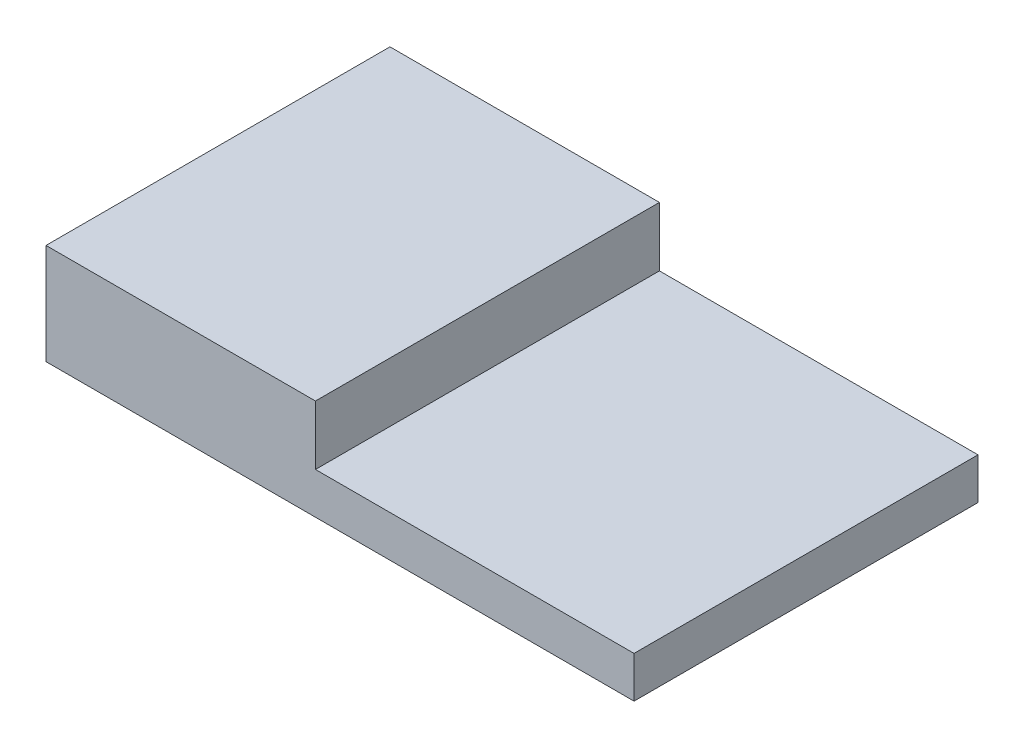
ISO-10303-21;
HEADER;
FILE_DESCRIPTION(('STEP AP214'),'2;1');
FILE_NAME('part.step','',(''),(''),'','','');
FILE_SCHEMA(('AUTOMOTIVE_DESIGN { 1 0 10303 214 1 1 1 1 }'));
ENDSEC;
DATA;
#1=APPLICATION_CONTEXT('core data for automotive mechanical design processes');
#2=APPLICATION_PROTOCOL_DEFINITION('international standard','automotive_design',2000,#1);
#3=PRODUCT_CONTEXT('',#1,'mechanical');
#4=PRODUCT('Part','Part','',(#3));
#5=PRODUCT_RELATED_PRODUCT_CATEGORY('part','',(#4));
#6=PRODUCT_DEFINITION_FORMATION('','',#4);
#7=PRODUCT_DEFINITION_CONTEXT('part definition',#1,'design');
#8=PRODUCT_DEFINITION('design','',#6,#7);
#9=PRODUCT_DEFINITION_SHAPE('','',#8);
#10=(LENGTH_UNIT() NAMED_UNIT(*) SI_UNIT(.MILLI.,.METRE.));
#11=(NAMED_UNIT(*) PLANE_ANGLE_UNIT() SI_UNIT($,.RADIAN.));
#12=(NAMED_UNIT(*) SI_UNIT($,.STERADIAN.) SOLID_ANGLE_UNIT());
#13=UNCERTAINTY_MEASURE_WITH_UNIT(LENGTH_MEASURE(1.E-05),#10,'distance_accuracy_value','');
#14=(GEOMETRIC_REPRESENTATION_CONTEXT(3) GLOBAL_UNCERTAINTY_ASSIGNED_CONTEXT((#13)) GLOBAL_UNIT_ASSIGNED_CONTEXT((#10,
#11,#12)) REPRESENTATION_CONTEXT('',''));
#15=CARTESIAN_POINT('',(0.,0.,0.));
#16=DIRECTION('',(0.,0.,1.));
#17=DIRECTION('',(1.,0.,0.));
#18=AXIS2_PLACEMENT_3D('',#15,#16,#17);
#19=CARTESIAN_POINT('',(49.74579499682,18.5857311320755,-63.5));
#20=DIRECTION('',(0.,1.,0.));
#21=DIRECTION('',(0.,0.,1.));
#22=AXIS2_PLACEMENT_3D('',#19,#20,#21);
#23=PLANE('',#22);
#24=DIRECTION('',(-1.,0.,0.));
#25=VECTOR('',#24,1.);
#26=CARTESIAN_POINT('',(49.74579499682,18.5857311320755,0.));
#27=LINE('',#26,#25);
#28=CARTESIAN_POINT('',(49.74579499682,18.5857311320755,0.));
#29=VERTEX_POINT('',#28);
#30=CARTESIAN_POINT('',(0.,18.5857311320755,0.));
#31=VERTEX_POINT('',#30);
#32=EDGE_CURVE('E115',#29,#31,#27,.T.);
#33=ORIENTED_EDGE('',*,*,#32,.F.);
#34=DIRECTION('',(0.,0.,1.));
#35=VECTOR('',#34,1.);
#36=CARTESIAN_POINT('',(49.74579499682,18.5857311320755,-63.5));
#37=LINE('',#36,#35);
#38=CARTESIAN_POINT('',(49.74579499682,18.5857311320755,-63.5));
#39=VERTEX_POINT('',#38);
#40=EDGE_CURVE('E11',#39,#29,#37,.T.);
#41=ORIENTED_EDGE('',*,*,#40,.F.);
#42=DIRECTION('',(-1.,0.,0.));
#43=VECTOR('',#42,1.);
#44=CARTESIAN_POINT('',(49.74579499682,18.5857311320755,-63.5));
#45=LINE('',#44,#43);
#46=CARTESIAN_POINT('',(0.,18.5857311320755,-63.5));
#47=VERTEX_POINT('',#46);
#48=EDGE_CURVE('E129',#39,#47,#45,.T.);
#49=ORIENTED_EDGE('',*,*,#48,.T.);
#50=DIRECTION('',(0.,0.,1.));
#51=VECTOR('',#50,1.);
#52=CARTESIAN_POINT('',(0.,18.5857311320755,-63.5));
#53=LINE('',#52,#51);
#54=EDGE_CURVE('E33',#47,#31,#53,.T.);
#55=ORIENTED_EDGE('',*,*,#54,.T.);
#56=EDGE_LOOP('',(#33,#41,#49,#55));
#57=FACE_BOUND('',#56,.T.);
#58=ADVANCED_FACE('F30',(#57),#23,.T.);
#59=CARTESIAN_POINT('',(49.74579499682,7.63797169811321,-63.5));
#60=DIRECTION('',(1.,0.,0.));
#61=DIRECTION('',(0.,0.,-1.));
#62=AXIS2_PLACEMENT_3D('',#59,#60,#61);
#63=PLANE('',#62);
#64=DIRECTION('',(0.,1.,0.));
#65=VECTOR('',#64,1.);
#66=CARTESIAN_POINT('',(49.74579499682,7.63797169811321,0.));
#67=LINE('',#66,#65);
#68=CARTESIAN_POINT('',(49.74579499682,7.63797169811321,0.));
#69=VERTEX_POINT('',#68);
#70=EDGE_CURVE('E127',#69,#29,#67,.T.);
#71=ORIENTED_EDGE('',*,*,#70,.F.);
#72=DIRECTION('',(0.,0.,1.));
#73=VECTOR('',#72,1.);
#74=CARTESIAN_POINT('',(49.74579499682,7.63797169811321,-63.5));
#75=LINE('',#74,#73);
#76=CARTESIAN_POINT('',(49.74579499682,7.63797169811321,-63.5));
#77=VERTEX_POINT('',#76);
#78=EDGE_CURVE('E39',#77,#69,#75,.T.);
#79=ORIENTED_EDGE('',*,*,#78,.F.);
#80=DIRECTION('',(0.,1.,0.));
#81=VECTOR('',#80,1.);
#82=CARTESIAN_POINT('',(49.74579499682,7.63797169811321,-63.5));
#83=LINE('',#82,#81);
#84=EDGE_CURVE('E105',#77,#39,#83,.T.);
#85=ORIENTED_EDGE('',*,*,#84,.T.);
#86=ORIENTED_EDGE('',*,*,#40,.T.);
#87=EDGE_LOOP('',(#71,#79,#85,#86));
#88=FACE_BOUND('',#87,.T.);
#89=ADVANCED_FACE('F137',(#88),#63,.T.);
#90=CARTESIAN_POINT('',(108.558177072292,7.63797169811321,-63.5));
#91=DIRECTION('',(0.,1.,0.));
#92=DIRECTION('',(0.,0.,1.));
#93=AXIS2_PLACEMENT_3D('',#90,#91,#92);
#94=PLANE('',#93);
#95=DIRECTION('',(-1.,0.,0.));
#96=VECTOR('',#95,1.);
#97=CARTESIAN_POINT('',(108.558177072292,7.63797169811321,0.));
#98=LINE('',#97,#96);
#99=CARTESIAN_POINT('',(108.558177072292,7.63797169811321,0.));
#100=VERTEX_POINT('',#99);
#101=EDGE_CURVE('E92',#100,#69,#98,.T.);
#102=ORIENTED_EDGE('',*,*,#101,.F.);
#103=DIRECTION('',(0.,0.,1.));
#104=VECTOR('',#103,1.);
#105=CARTESIAN_POINT('',(108.558177072292,7.63797169811321,-63.5));
#106=LINE('',#105,#104);
#107=CARTESIAN_POINT('',(108.558177072292,7.63797169811321,-63.5));
#108=VERTEX_POINT('',#107);
#109=EDGE_CURVE('E87',#108,#100,#106,.T.);
#110=ORIENTED_EDGE('',*,*,#109,.F.);
#111=DIRECTION('',(-1.,0.,0.));
#112=VECTOR('',#111,1.);
#113=CARTESIAN_POINT('',(108.558177072292,7.63797169811321,-63.5));
#114=LINE('',#113,#112);
#115=EDGE_CURVE('E90',#108,#77,#114,.T.);
#116=ORIENTED_EDGE('',*,*,#115,.T.);
#117=ORIENTED_EDGE('',*,*,#78,.T.);
#118=EDGE_LOOP('',(#102,#110,#116,#117));
#119=FACE_BOUND('',#118,.T.);
#120=ADVANCED_FACE('F89',(#119),#94,.T.);
#121=CARTESIAN_POINT('',(108.558177072292,0.,-63.5));
#122=DIRECTION('',(1.,0.,0.));
#123=DIRECTION('',(0.,0.,-1.));
#124=AXIS2_PLACEMENT_3D('',#121,#122,#123);
#125=PLANE('',#124);
#126=DIRECTION('',(0.,1.,0.));
#127=VECTOR('',#126,1.);
#128=CARTESIAN_POINT('',(108.558177072292,0.,0.));
#129=LINE('',#128,#127);
#130=CARTESIAN_POINT('',(108.558177072292,0.,0.));
#131=VERTEX_POINT('',#130);
#132=EDGE_CURVE('E124',#131,#100,#129,.T.);
#133=ORIENTED_EDGE('',*,*,#132,.F.);
#134=DIRECTION('',(0.,0.,1.));
#135=VECTOR('',#134,1.);
#136=CARTESIAN_POINT('',(108.558177072292,0.,-63.5));
#137=LINE('',#136,#135);
#138=CARTESIAN_POINT('',(108.558177072292,0.,-63.5));
#139=VERTEX_POINT('',#138);
#140=EDGE_CURVE('E97',#139,#131,#137,.T.);
#141=ORIENTED_EDGE('',*,*,#140,.F.);
#142=DIRECTION('',(0.,1.,0.));
#143=VECTOR('',#142,1.);
#144=CARTESIAN_POINT('',(108.558177072292,0.,-63.5));
#145=LINE('',#144,#143);
#146=EDGE_CURVE('E103',#139,#108,#145,.T.);
#147=ORIENTED_EDGE('',*,*,#146,.T.);
#148=ORIENTED_EDGE('',*,*,#109,.T.);
#149=EDGE_LOOP('',(#133,#141,#147,#148));
#150=FACE_BOUND('',#149,.T.);
#151=ADVANCED_FACE('F107',(#150),#125,.T.);
#152=CARTESIAN_POINT('',(0.,0.,-63.5));
#153=DIRECTION('',(0.,-1.,0.));
#154=DIRECTION('',(0.,0.,-1.));
#155=AXIS2_PLACEMENT_3D('',#152,#153,#154);
#156=PLANE('',#155);
#157=DIRECTION('',(1.,0.,0.));
#158=VECTOR('',#157,1.);
#159=CARTESIAN_POINT('',(0.,0.,0.));
#160=LINE('',#159,#158);
#161=CARTESIAN_POINT('',(0.,0.,0.));
#162=VERTEX_POINT('',#161);
#163=EDGE_CURVE('E121',#162,#131,#160,.T.);
#164=ORIENTED_EDGE('',*,*,#163,.F.);
#165=DIRECTION('',(0.,0.,1.));
#166=VECTOR('',#165,1.);
#167=CARTESIAN_POINT('',(0.,0.,-63.5));
#168=LINE('',#167,#166);
#169=CARTESIAN_POINT('',(0.,0.,-63.5));
#170=VERTEX_POINT('',#169);
#171=EDGE_CURVE('E132',#170,#162,#168,.T.);
#172=ORIENTED_EDGE('',*,*,#171,.F.);
#173=DIRECTION('',(1.,0.,0.));
#174=VECTOR('',#173,1.);
#175=CARTESIAN_POINT('',(0.,0.,-63.5));
#176=LINE('',#175,#174);
#177=EDGE_CURVE('E108',#170,#139,#176,.T.);
#178=ORIENTED_EDGE('',*,*,#177,.T.);
#179=ORIENTED_EDGE('',*,*,#140,.T.);
#180=EDGE_LOOP('',(#164,#172,#178,#179));
#181=FACE_BOUND('',#180,.T.);
#182=ADVANCED_FACE('F150',(#181),#156,.T.);
#183=CARTESIAN_POINT('',(0.,18.5857311320755,-63.5));
#184=DIRECTION('',(-1.,0.,0.));
#185=DIRECTION('',(0.,0.,1.));
#186=AXIS2_PLACEMENT_3D('',#183,#184,#185);
#187=PLANE('',#186);
#188=DIRECTION('',(0.,-1.,0.));
#189=VECTOR('',#188,1.);
#190=CARTESIAN_POINT('',(0.,18.5857311320755,0.));
#191=LINE('',#190,#189);
#192=EDGE_CURVE('E118',#31,#162,#191,.T.);
#193=ORIENTED_EDGE('',*,*,#192,.F.);
#194=ORIENTED_EDGE('',*,*,#54,.F.);
#195=DIRECTION('',(0.,-1.,0.));
#196=VECTOR('',#195,1.);
#197=CARTESIAN_POINT('',(0.,18.5857311320755,-63.5));
#198=LINE('',#197,#196);
#199=EDGE_CURVE('E110',#47,#170,#198,.T.);
#200=ORIENTED_EDGE('',*,*,#199,.T.);
#201=ORIENTED_EDGE('',*,*,#171,.T.);
#202=EDGE_LOOP('',(#193,#194,#200,#201));
#203=FACE_BOUND('',#202,.T.);
#204=ADVANCED_FACE('F134',(#203),#187,.T.);
#205=CARTESIAN_POINT('',(0.,18.5857311320755,-63.5));
#206=DIRECTION('',(0.,0.,1.));
#207=DIRECTION('',(1.,0.,0.));
#208=AXIS2_PLACEMENT_3D('',#205,#206,#207);
#209=PLANE('',#208);
#210=ORIENTED_EDGE('',*,*,#48,.F.);
#211=ORIENTED_EDGE('',*,*,#84,.F.);
#212=ORIENTED_EDGE('',*,*,#115,.F.);
#213=ORIENTED_EDGE('',*,*,#146,.F.);
#214=ORIENTED_EDGE('',*,*,#177,.F.);
#215=ORIENTED_EDGE('',*,*,#199,.F.);
#216=EDGE_LOOP('',(#210,#211,#212,#213,#214,#215));
#217=FACE_BOUND('',#216,.T.);
#218=ADVANCED_FACE('F101',(#217),#209,.F.);
#219=CARTESIAN_POINT('',(0.,18.5857311320755,0.));
#220=DIRECTION('',(0.,0.,1.));
#221=DIRECTION('',(1.,0.,0.));
#222=AXIS2_PLACEMENT_3D('',#219,#220,#221);
#223=PLANE('',#222);
#224=ORIENTED_EDGE('',*,*,#32,.T.);
#225=ORIENTED_EDGE('',*,*,#192,.T.);
#226=ORIENTED_EDGE('',*,*,#163,.T.);
#227=ORIENTED_EDGE('',*,*,#132,.T.);
#228=ORIENTED_EDGE('',*,*,#101,.T.);
#229=ORIENTED_EDGE('',*,*,#70,.T.);
#230=EDGE_LOOP('',(#224,#225,#226,#227,#228,#229));
#231=FACE_BOUND('',#230,.T.);
#232=ADVANCED_FACE('F136',(#231),#223,.T.);
#233=CLOSED_SHELL('',(#58,#89,#120,#151,#182,#204,#218,#232));
#234=MANIFOLD_SOLID_BREP('B2',#233);
#235=ADVANCED_BREP_SHAPE_REPRESENTATION('',(#18,#234),#14);
#236=SHAPE_DEFINITION_REPRESENTATION(#9,#235);
ENDSEC;
END-ISO-10303-21;
